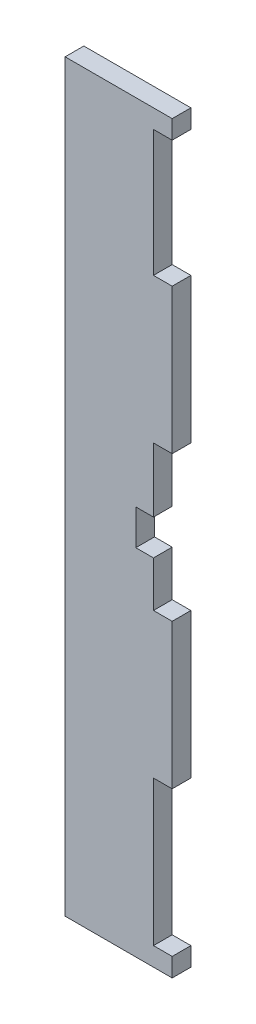
ISO-10303-21;
HEADER;
FILE_DESCRIPTION(('STEP AP214'),'2;1');
FILE_NAME('part.step','',(''),(''),'','','');
FILE_SCHEMA(('AUTOMOTIVE_DESIGN { 1 0 10303 214 1 1 1 1 }'));
ENDSEC;
DATA;
#1=APPLICATION_CONTEXT('core data for automotive mechanical design processes');
#2=APPLICATION_PROTOCOL_DEFINITION('international standard','automotive_design',2000,#1);
#3=PRODUCT_CONTEXT('',#1,'mechanical');
#4=PRODUCT('Part','Part','',(#3));
#5=PRODUCT_RELATED_PRODUCT_CATEGORY('part','',(#4));
#6=PRODUCT_DEFINITION_FORMATION('','',#4);
#7=PRODUCT_DEFINITION_CONTEXT('part definition',#1,'design');
#8=PRODUCT_DEFINITION('design','',#6,#7);
#9=PRODUCT_DEFINITION_SHAPE('','',#8);
#10=(LENGTH_UNIT() NAMED_UNIT(*) SI_UNIT(.MILLI.,.METRE.));
#11=(NAMED_UNIT(*) PLANE_ANGLE_UNIT() SI_UNIT($,.RADIAN.));
#12=(NAMED_UNIT(*) SI_UNIT($,.STERADIAN.) SOLID_ANGLE_UNIT());
#13=UNCERTAINTY_MEASURE_WITH_UNIT(LENGTH_MEASURE(1.E-05),#10,'distance_accuracy_value','');
#14=(GEOMETRIC_REPRESENTATION_CONTEXT(3) GLOBAL_UNCERTAINTY_ASSIGNED_CONTEXT((#13)) GLOBAL_UNIT_ASSIGNED_CONTEXT((#10,
#11,#12)) REPRESENTATION_CONTEXT('',''));
#15=CARTESIAN_POINT('',(0.,0.,0.));
#16=DIRECTION('',(0.,0.,1.));
#17=DIRECTION('',(1.,0.,0.));
#18=AXIS2_PLACEMENT_3D('',#15,#16,#17);
#19=CARTESIAN_POINT('',(15.,55.62,3.175));
#20=DIRECTION('',(-1.,0.,0.));
#21=DIRECTION('',(0.,-1.,0.));
#22=AXIS2_PLACEMENT_3D('',#19,#20,#21);
#23=PLANE('',#22);
#24=DIRECTION('',(0.,1.,0.));
#25=VECTOR('',#24,1.);
#26=CARTESIAN_POINT('',(15.,55.62,0.));
#27=LINE('',#26,#25);
#28=CARTESIAN_POINT('',(15.,55.62,0.));
#29=VERTEX_POINT('',#28);
#30=CARTESIAN_POINT('',(14.9999999999999,63.35,0.));
#31=VERTEX_POINT('',#30);
#32=EDGE_CURVE('E209',#29,#31,#27,.T.);
#33=ORIENTED_EDGE('',*,*,#32,.T.);
#34=DIRECTION('',(0.,0.,-1.));
#35=VECTOR('',#34,1.);
#36=CARTESIAN_POINT('',(14.9999999999999,63.35,3.176));
#37=LINE('',#36,#35);
#38=CARTESIAN_POINT('',(14.9999999999999,63.35,3.175));
#39=VERTEX_POINT('',#38);
#40=EDGE_CURVE('E326',#39,#31,#37,.T.);
#41=ORIENTED_EDGE('',*,*,#40,.F.);
#42=DIRECTION('',(0.,1.,0.));
#43=VECTOR('',#42,1.);
#44=CARTESIAN_POINT('',(15.,55.62,3.175));
#45=LINE('',#44,#43);
#46=CARTESIAN_POINT('',(15.,55.62,3.175));
#47=VERTEX_POINT('',#46);
#48=EDGE_CURVE('E293',#47,#39,#45,.T.);
#49=ORIENTED_EDGE('',*,*,#48,.F.);
#50=DIRECTION('',(0.,0.,-1.));
#51=VECTOR('',#50,1.);
#52=CARTESIAN_POINT('',(15.,55.62,3.175));
#53=LINE('',#52,#51);
#54=EDGE_CURVE('E240',#47,#29,#53,.T.);
#55=ORIENTED_EDGE('',*,*,#54,.T.);
#56=EDGE_LOOP('',(#33,#41,#49,#55));
#57=FACE_BOUND('',#56,.T.);
#58=ADVANCED_FACE('F33',(#57),#23,.F.);
#59=CARTESIAN_POINT('',(0.,3.175,3.175));
#60=DIRECTION('',(1.,0.,0.));
#61=DIRECTION('',(0.,0.,-1.));
#62=AXIS2_PLACEMENT_3D('',#59,#60,#61);
#63=PLANE('',#62);
#64=DIRECTION('',(0.,-1.,0.));
#65=VECTOR('',#64,1.);
#66=CARTESIAN_POINT('',(0.,3.175,0.));
#67=LINE('',#66,#65);
#68=CARTESIAN_POINT('',(0.,129.525,0.));
#69=VERTEX_POINT('',#68);
#70=CARTESIAN_POINT('',(0.,3.175,0.));
#71=VERTEX_POINT('',#70);
#72=EDGE_CURVE('E190',#69,#71,#67,.T.);
#73=ORIENTED_EDGE('',*,*,#72,.T.);
#74=DIRECTION('',(0.,0.,-1.));
#75=VECTOR('',#74,1.);
#76=CARTESIAN_POINT('',(0.,3.175,3.175));
#77=LINE('',#76,#75);
#78=CARTESIAN_POINT('',(0.,3.175,3.175));
#79=VERTEX_POINT('',#78);
#80=EDGE_CURVE('E11',#79,#71,#77,.T.);
#81=ORIENTED_EDGE('',*,*,#80,.F.);
#82=DIRECTION('',(0.,-1.,0.));
#83=VECTOR('',#82,1.);
#84=CARTESIAN_POINT('',(0.,3.175,3.175));
#85=LINE('',#84,#83);
#86=CARTESIAN_POINT('',(0.,129.525,3.175));
#87=VERTEX_POINT('',#86);
#88=EDGE_CURVE('E224',#87,#79,#85,.T.);
#89=ORIENTED_EDGE('',*,*,#88,.F.);
#90=DIRECTION('',(0.,0.,-1.));
#91=VECTOR('',#90,1.);
#92=CARTESIAN_POINT('',(0.,129.525,3.175));
#93=LINE('',#92,#91);
#94=EDGE_CURVE('E186',#87,#69,#93,.T.);
#95=ORIENTED_EDGE('',*,*,#94,.T.);
#96=EDGE_LOOP('',(#73,#81,#89,#95));
#97=FACE_BOUND('',#96,.T.);
#98=ADVANCED_FACE('F35',(#97),#63,.F.);
#99=CARTESIAN_POINT('',(18.1749999999999,3.17500000000001,3.175));
#100=DIRECTION('',(0.,1.,0.));
#101=DIRECTION('',(-1.,0.,0.));
#102=AXIS2_PLACEMENT_3D('',#99,#100,#101);
#103=PLANE('',#102);
#104=DIRECTION('',(1.,0.,0.));
#105=VECTOR('',#104,1.);
#106=CARTESIAN_POINT('',(18.1749999999999,3.17500000000001,0.));
#107=LINE('',#106,#105);
#108=CARTESIAN_POINT('',(18.1749999999999,3.17500000000001,0.));
#109=VERTEX_POINT('',#108);
#110=EDGE_CURVE('E193',#71,#109,#107,.T.);
#111=ORIENTED_EDGE('',*,*,#110,.T.);
#112=DIRECTION('',(0.,0.,-1.));
#113=VECTOR('',#112,1.);
#114=CARTESIAN_POINT('',(18.1749999999999,3.17500000000001,3.175));
#115=LINE('',#114,#113);
#116=CARTESIAN_POINT('',(18.1749999999999,3.17500000000001,3.175));
#117=VERTEX_POINT('',#116);
#118=EDGE_CURVE('E41',#117,#109,#115,.T.);
#119=ORIENTED_EDGE('',*,*,#118,.F.);
#120=DIRECTION('',(1.,0.,0.));
#121=VECTOR('',#120,1.);
#122=CARTESIAN_POINT('',(0.,3.175,3.175));
#123=LINE('',#122,#121);
#124=EDGE_CURVE('E121',#79,#117,#123,.T.);
#125=ORIENTED_EDGE('',*,*,#124,.F.);
#126=ORIENTED_EDGE('',*,*,#80,.T.);
#127=EDGE_LOOP('',(#111,#119,#125,#126));
#128=FACE_BOUND('',#127,.T.);
#129=ADVANCED_FACE('F396',(#128),#103,.F.);
#130=CARTESIAN_POINT('',(18.1749999999999,6.35000000000001,3.175));
#131=DIRECTION('',(-1.,0.,0.));
#132=DIRECTION('',(0.,0.,1.));
#133=AXIS2_PLACEMENT_3D('',#130,#131,#132);
#134=PLANE('',#133);
#135=DIRECTION('',(0.,1.,0.));
#136=VECTOR('',#135,1.);
#137=CARTESIAN_POINT('',(18.1749999999999,6.35000000000001,0.));
#138=LINE('',#137,#136);
#139=CARTESIAN_POINT('',(18.1749999999999,6.35000000000001,0.));
#140=VERTEX_POINT('',#139);
#141=EDGE_CURVE('E196',#109,#140,#138,.T.);
#142=ORIENTED_EDGE('',*,*,#141,.T.);
#143=DIRECTION('',(0.,0.,-1.));
#144=VECTOR('',#143,1.);
#145=CARTESIAN_POINT('',(18.1749999999999,6.35000000000001,3.175));
#146=LINE('',#145,#144);
#147=CARTESIAN_POINT('',(18.1749999999999,6.35000000000001,3.175));
#148=VERTEX_POINT('',#147);
#149=EDGE_CURVE('E255',#148,#140,#146,.T.);
#150=ORIENTED_EDGE('',*,*,#149,.F.);
#151=DIRECTION('',(0.,1.,0.));
#152=VECTOR('',#151,1.);
#153=CARTESIAN_POINT('',(18.1749999999999,6.35000000000001,3.175));
#154=LINE('',#153,#152);
#155=EDGE_CURVE('E263',#117,#148,#154,.T.);
#156=ORIENTED_EDGE('',*,*,#155,.F.);
#157=ORIENTED_EDGE('',*,*,#118,.T.);
#158=EDGE_LOOP('',(#142,#150,#156,#157));
#159=FACE_BOUND('',#158,.T.);
#160=ADVANCED_FACE('F261',(#159),#134,.F.);
#161=CARTESIAN_POINT('',(18.1749999999999,6.35000000000001,3.175));
#162=DIRECTION('',(0.,-1.,0.));
#163=DIRECTION('',(1.,0.,0.));
#164=AXIS2_PLACEMENT_3D('',#161,#162,#163);
#165=PLANE('',#164);
#166=DIRECTION('',(-1.,0.,0.));
#167=VECTOR('',#166,1.);
#168=CARTESIAN_POINT('',(18.1749999999999,6.35000000000001,0.));
#169=LINE('',#168,#167);
#170=CARTESIAN_POINT('',(14.9999999999999,6.35000000000001,0.));
#171=VERTEX_POINT('',#170);
#172=EDGE_CURVE('E198',#140,#171,#169,.T.);
#173=ORIENTED_EDGE('',*,*,#172,.T.);
#174=DIRECTION('',(0.,0.,-1.));
#175=VECTOR('',#174,1.);
#176=CARTESIAN_POINT('',(14.9999999999999,6.35000000000001,3.175));
#177=LINE('',#176,#175);
#178=CARTESIAN_POINT('',(14.9999999999999,6.35000000000001,3.175));
#179=VERTEX_POINT('',#178);
#180=EDGE_CURVE('E252',#179,#171,#177,.T.);
#181=ORIENTED_EDGE('',*,*,#180,.F.);
#182=DIRECTION('',(-1.,0.,0.));
#183=VECTOR('',#182,1.);
#184=CARTESIAN_POINT('',(18.1749999999999,6.35000000000001,3.175));
#185=LINE('',#184,#183);
#186=EDGE_CURVE('E282',#148,#179,#185,.T.);
#187=ORIENTED_EDGE('',*,*,#186,.F.);
#188=ORIENTED_EDGE('',*,*,#149,.T.);
#189=EDGE_LOOP('',(#173,#181,#187,#188));
#190=FACE_BOUND('',#189,.T.);
#191=ADVANCED_FACE('F273',(#190),#165,.F.);
#192=CARTESIAN_POINT('',(14.9999999999999,6.35000000000001,3.175));
#193=DIRECTION('',(-1.,0.,0.));
#194=DIRECTION('',(0.,-1.,0.));
#195=AXIS2_PLACEMENT_3D('',#192,#193,#194);
#196=PLANE('',#195);
#197=DIRECTION('',(0.,1.,0.));
#198=VECTOR('',#197,1.);
#199=CARTESIAN_POINT('',(14.9999999999999,6.35000000000001,0.));
#200=LINE('',#199,#198);
#201=CARTESIAN_POINT('',(15.,30.985,0.));
#202=VERTEX_POINT('',#201);
#203=EDGE_CURVE('E200',#171,#202,#200,.T.);
#204=ORIENTED_EDGE('',*,*,#203,.T.);
#205=DIRECTION('',(0.,0.,-1.));
#206=VECTOR('',#205,1.);
#207=CARTESIAN_POINT('',(15.,30.985,3.175));
#208=LINE('',#207,#206);
#209=CARTESIAN_POINT('',(15.,30.985,3.175));
#210=VERTEX_POINT('',#209);
#211=EDGE_CURVE('E249',#210,#202,#208,.T.);
#212=ORIENTED_EDGE('',*,*,#211,.F.);
#213=DIRECTION('',(0.,1.,0.));
#214=VECTOR('',#213,1.);
#215=CARTESIAN_POINT('',(14.9999999999999,6.35000000000001,3.175));
#216=LINE('',#215,#214);
#217=EDGE_CURVE('E279',#179,#210,#216,.T.);
#218=ORIENTED_EDGE('',*,*,#217,.F.);
#219=ORIENTED_EDGE('',*,*,#180,.T.);
#220=EDGE_LOOP('',(#204,#212,#218,#219));
#221=FACE_BOUND('',#220,.T.);
#222=ADVANCED_FACE('F277',(#221),#196,.F.);
#223=CARTESIAN_POINT('',(18.175,30.985,3.175));
#224=DIRECTION('',(0.,1.,0.));
#225=DIRECTION('',(-1.,0.,0.));
#226=AXIS2_PLACEMENT_3D('',#223,#224,#225);
#227=PLANE('',#226);
#228=DIRECTION('',(1.,0.,0.));
#229=VECTOR('',#228,1.);
#230=CARTESIAN_POINT('',(18.175,30.985,0.));
#231=LINE('',#230,#229);
#232=CARTESIAN_POINT('',(18.175,30.985,0.));
#233=VERTEX_POINT('',#232);
#234=EDGE_CURVE('E202',#202,#233,#231,.T.);
#235=ORIENTED_EDGE('',*,*,#234,.T.);
#236=DIRECTION('',(0.,0.,-1.));
#237=VECTOR('',#236,1.);
#238=CARTESIAN_POINT('',(18.175,30.985,3.175));
#239=LINE('',#238,#237);
#240=CARTESIAN_POINT('',(18.175,30.985,3.175));
#241=VERTEX_POINT('',#240);
#242=EDGE_CURVE('E246',#241,#233,#239,.T.);
#243=ORIENTED_EDGE('',*,*,#242,.F.);
#244=DIRECTION('',(1.,0.,0.));
#245=VECTOR('',#244,1.);
#246=CARTESIAN_POINT('',(18.175,30.985,3.175));
#247=LINE('',#246,#245);
#248=EDGE_CURVE('E281',#210,#241,#247,.T.);
#249=ORIENTED_EDGE('',*,*,#248,.F.);
#250=ORIENTED_EDGE('',*,*,#211,.T.);
#251=EDGE_LOOP('',(#235,#243,#249,#250));
#252=FACE_BOUND('',#251,.T.);
#253=ADVANCED_FACE('F408',(#252),#227,.F.);
#254=CARTESIAN_POINT('',(18.175,30.985,3.175));
#255=DIRECTION('',(-1.,0.,0.));
#256=DIRECTION('',(0.,-1.,0.));
#257=AXIS2_PLACEMENT_3D('',#254,#255,#256);
#258=PLANE('',#257);
#259=DIRECTION('',(0.,1.,0.));
#260=VECTOR('',#259,1.);
#261=CARTESIAN_POINT('',(18.175,30.985,0.));
#262=LINE('',#261,#260);
#263=CARTESIAN_POINT('',(18.175,55.62,0.));
#264=VERTEX_POINT('',#263);
#265=EDGE_CURVE('E204',#233,#264,#262,.T.);
#266=ORIENTED_EDGE('',*,*,#265,.T.);
#267=DIRECTION('',(0.,0.,-1.));
#268=VECTOR('',#267,1.);
#269=CARTESIAN_POINT('',(18.175,55.62,3.175));
#270=LINE('',#269,#268);
#271=CARTESIAN_POINT('',(18.175,55.62,3.175));
#272=VERTEX_POINT('',#271);
#273=EDGE_CURVE('E243',#272,#264,#270,.T.);
#274=ORIENTED_EDGE('',*,*,#273,.F.);
#275=DIRECTION('',(0.,1.,0.));
#276=VECTOR('',#275,1.);
#277=CARTESIAN_POINT('',(18.175,30.985,3.175));
#278=LINE('',#277,#276);
#279=EDGE_CURVE('E284',#241,#272,#278,.T.);
#280=ORIENTED_EDGE('',*,*,#279,.F.);
#281=ORIENTED_EDGE('',*,*,#242,.T.);
#282=EDGE_LOOP('',(#266,#274,#280,#281));
#283=FACE_BOUND('',#282,.T.);
#284=ADVANCED_FACE('F403',(#283),#258,.F.);
#285=CARTESIAN_POINT('',(18.175,55.62,3.175));
#286=DIRECTION('',(0.,-1.,0.));
#287=DIRECTION('',(0.,0.,-1.));
#288=AXIS2_PLACEMENT_3D('',#285,#286,#287);
#289=PLANE('',#288);
#290=DIRECTION('',(-1.,0.,0.));
#291=VECTOR('',#290,1.);
#292=CARTESIAN_POINT('',(18.175,55.62,0.));
#293=LINE('',#292,#291);
#294=EDGE_CURVE('E206',#264,#29,#293,.T.);
#295=ORIENTED_EDGE('',*,*,#294,.T.);
#296=ORIENTED_EDGE('',*,*,#54,.F.);
#297=DIRECTION('',(-1.,0.,0.));
#298=VECTOR('',#297,1.);
#299=CARTESIAN_POINT('',(18.175,55.62,3.175));
#300=LINE('',#299,#298);
#301=EDGE_CURVE('E290',#272,#47,#300,.T.);
#302=ORIENTED_EDGE('',*,*,#301,.F.);
#303=ORIENTED_EDGE('',*,*,#273,.T.);
#304=EDGE_LOOP('',(#295,#296,#302,#303));
#305=FACE_BOUND('',#304,.T.);
#306=ADVANCED_FACE('F399',(#305),#289,.F.);
#307=CARTESIAN_POINT('',(14.9999999999999,69.35,3.175));
#308=VERTEX_POINT('',#307);
#309=CARTESIAN_POINT('',(15.,80.255,3.175));
#310=VERTEX_POINT('',#309);
#311=EDGE_CURVE('E292',#308,#310,#45,.T.);
#312=ORIENTED_EDGE('',*,*,#311,.F.);
#313=DIRECTION('',(0.,0.,-1.));
#314=VECTOR('',#313,1.);
#315=CARTESIAN_POINT('',(14.9999999999999,69.35,3.176));
#316=LINE('',#315,#314);
#317=CARTESIAN_POINT('',(14.9999999999999,69.35,0.));
#318=VERTEX_POINT('',#317);
#319=EDGE_CURVE('E322',#308,#318,#316,.T.);
#320=ORIENTED_EDGE('',*,*,#319,.T.);
#321=CARTESIAN_POINT('',(15.,80.255,0.));
#322=VERTEX_POINT('',#321);
#323=EDGE_CURVE('E208',#318,#322,#27,.T.);
#324=ORIENTED_EDGE('',*,*,#323,.T.);
#325=DIRECTION('',(0.,0.,-1.));
#326=VECTOR('',#325,1.);
#327=CARTESIAN_POINT('',(15.,80.255,3.175));
#328=LINE('',#327,#326);
#329=EDGE_CURVE('E237',#310,#322,#328,.T.);
#330=ORIENTED_EDGE('',*,*,#329,.F.);
#331=EDGE_LOOP('',(#312,#320,#324,#330));
#332=FACE_BOUND('',#331,.T.);
#333=ADVANCED_FACE('F373',(#332),#23,.F.);
#334=CARTESIAN_POINT('',(18.175,80.255,3.175));
#335=DIRECTION('',(0.,1.,0.));
#336=DIRECTION('',(0.,0.,1.));
#337=AXIS2_PLACEMENT_3D('',#334,#335,#336);
#338=PLANE('',#337);
#339=DIRECTION('',(1.,0.,0.));
#340=VECTOR('',#339,1.);
#341=CARTESIAN_POINT('',(18.175,80.255,0.));
#342=LINE('',#341,#340);
#343=CARTESIAN_POINT('',(18.175,80.255,0.));
#344=VERTEX_POINT('',#343);
#345=EDGE_CURVE('E212',#322,#344,#342,.T.);
#346=ORIENTED_EDGE('',*,*,#345,.T.);
#347=DIRECTION('',(0.,0.,-1.));
#348=VECTOR('',#347,1.);
#349=CARTESIAN_POINT('',(18.175,80.255,3.175));
#350=LINE('',#349,#348);
#351=CARTESIAN_POINT('',(18.175,80.255,3.175));
#352=VERTEX_POINT('',#351);
#353=EDGE_CURVE('E234',#352,#344,#350,.T.);
#354=ORIENTED_EDGE('',*,*,#353,.F.);
#355=DIRECTION('',(1.,0.,0.));
#356=VECTOR('',#355,1.);
#357=CARTESIAN_POINT('',(18.175,80.255,3.175));
#358=LINE('',#357,#356);
#359=EDGE_CURVE('E295',#310,#352,#358,.T.);
#360=ORIENTED_EDGE('',*,*,#359,.F.);
#361=ORIENTED_EDGE('',*,*,#329,.T.);
#362=EDGE_LOOP('',(#346,#354,#360,#361));
#363=FACE_BOUND('',#362,.T.);
#364=ADVANCED_FACE('F379',(#363),#338,.F.);
#365=CARTESIAN_POINT('',(18.175,80.255,3.175));
#366=DIRECTION('',(-1.,0.,0.));
#367=DIRECTION('',(0.,-1.,0.));
#368=AXIS2_PLACEMENT_3D('',#365,#366,#367);
#369=PLANE('',#368);
#370=DIRECTION('',(0.,1.,0.));
#371=VECTOR('',#370,1.);
#372=CARTESIAN_POINT('',(18.175,80.255,0.));
#373=LINE('',#372,#371);
#374=CARTESIAN_POINT('',(18.175,104.89,0.));
#375=VERTEX_POINT('',#374);
#376=EDGE_CURVE('E214',#344,#375,#373,.T.);
#377=ORIENTED_EDGE('',*,*,#376,.T.);
#378=DIRECTION('',(0.,0.,-1.));
#379=VECTOR('',#378,1.);
#380=CARTESIAN_POINT('',(18.175,104.89,3.175));
#381=LINE('',#380,#379);
#382=CARTESIAN_POINT('',(18.175,104.89,3.175));
#383=VERTEX_POINT('',#382);
#384=EDGE_CURVE('E231',#383,#375,#381,.T.);
#385=ORIENTED_EDGE('',*,*,#384,.F.);
#386=DIRECTION('',(0.,1.,0.));
#387=VECTOR('',#386,1.);
#388=CARTESIAN_POINT('',(18.175,80.255,3.175));
#389=LINE('',#388,#387);
#390=EDGE_CURVE('E297',#352,#383,#389,.T.);
#391=ORIENTED_EDGE('',*,*,#390,.F.);
#392=ORIENTED_EDGE('',*,*,#353,.T.);
#393=EDGE_LOOP('',(#377,#385,#391,#392));
#394=FACE_BOUND('',#393,.T.);
#395=ADVANCED_FACE('F382',(#394),#369,.F.);
#396=CARTESIAN_POINT('',(18.175,104.89,3.175));
#397=DIRECTION('',(0.,-1.,0.));
#398=DIRECTION('',(0.,0.,-1.));
#399=AXIS2_PLACEMENT_3D('',#396,#397,#398);
#400=PLANE('',#399);
#401=DIRECTION('',(-1.,0.,0.));
#402=VECTOR('',#401,1.);
#403=CARTESIAN_POINT('',(18.175,104.89,0.));
#404=LINE('',#403,#402);
#405=CARTESIAN_POINT('',(15.,104.89,0.));
#406=VERTEX_POINT('',#405);
#407=EDGE_CURVE('E216',#375,#406,#404,.T.);
#408=ORIENTED_EDGE('',*,*,#407,.T.);
#409=DIRECTION('',(0.,0.,-1.));
#410=VECTOR('',#409,1.);
#411=CARTESIAN_POINT('',(15.,104.89,3.175));
#412=LINE('',#411,#410);
#413=CARTESIAN_POINT('',(15.,104.89,3.175));
#414=VERTEX_POINT('',#413);
#415=EDGE_CURVE('E228',#414,#406,#412,.T.);
#416=ORIENTED_EDGE('',*,*,#415,.F.);
#417=DIRECTION('',(-1.,0.,0.));
#418=VECTOR('',#417,1.);
#419=CARTESIAN_POINT('',(18.175,104.89,3.175));
#420=LINE('',#419,#418);
#421=EDGE_CURVE('E299',#383,#414,#420,.T.);
#422=ORIENTED_EDGE('',*,*,#421,.F.);
#423=ORIENTED_EDGE('',*,*,#384,.T.);
#424=EDGE_LOOP('',(#408,#416,#422,#423));
#425=FACE_BOUND('',#424,.T.);
#426=ADVANCED_FACE('F305',(#425),#400,.F.);
#427=CARTESIAN_POINT('',(15.,104.89,3.175));
#428=DIRECTION('',(-1.,0.,0.));
#429=DIRECTION('',(0.,-1.,0.));
#430=AXIS2_PLACEMENT_3D('',#427,#428,#429);
#431=PLANE('',#430);
#432=DIRECTION('',(0.,1.,0.));
#433=VECTOR('',#432,1.);
#434=CARTESIAN_POINT('',(15.,104.89,0.));
#435=LINE('',#434,#433);
#436=CARTESIAN_POINT('',(15.,126.35,0.));
#437=VERTEX_POINT('',#436);
#438=EDGE_CURVE('E218',#406,#437,#435,.T.);
#439=ORIENTED_EDGE('',*,*,#438,.T.);
#440=DIRECTION('',(0.,0.,-1.));
#441=VECTOR('',#440,1.);
#442=CARTESIAN_POINT('',(15.,126.35,3.175));
#443=LINE('',#442,#441);
#444=CARTESIAN_POINT('',(15.,126.35,3.175));
#445=VERTEX_POINT('',#444);
#446=EDGE_CURVE('E181',#445,#437,#443,.T.);
#447=ORIENTED_EDGE('',*,*,#446,.F.);
#448=DIRECTION('',(0.,1.,0.));
#449=VECTOR('',#448,1.);
#450=CARTESIAN_POINT('',(15.,104.89,3.175));
#451=LINE('',#450,#449);
#452=EDGE_CURVE('E168',#414,#445,#451,.T.);
#453=ORIENTED_EDGE('',*,*,#452,.F.);
#454=ORIENTED_EDGE('',*,*,#415,.T.);
#455=EDGE_LOOP('',(#439,#447,#453,#454));
#456=FACE_BOUND('',#455,.T.);
#457=ADVANCED_FACE('F309',(#456),#431,.F.);
#458=CARTESIAN_POINT('',(18.1749999999999,126.35,3.175));
#459=DIRECTION('',(0.,1.,0.));
#460=DIRECTION('',(-1.,0.,0.));
#461=AXIS2_PLACEMENT_3D('',#458,#459,#460);
#462=PLANE('',#461);
#463=DIRECTION('',(1.,0.,0.));
#464=VECTOR('',#463,1.);
#465=CARTESIAN_POINT('',(18.1749999999999,126.35,0.));
#466=LINE('',#465,#464);
#467=CARTESIAN_POINT('',(18.1749999999999,126.35,0.));
#468=VERTEX_POINT('',#467);
#469=EDGE_CURVE('E177',#437,#468,#466,.T.);
#470=ORIENTED_EDGE('',*,*,#469,.T.);
#471=DIRECTION('',(0.,0.,-1.));
#472=VECTOR('',#471,1.);
#473=CARTESIAN_POINT('',(18.1749999999999,126.35,3.175));
#474=LINE('',#473,#472);
#475=CARTESIAN_POINT('',(18.1749999999999,126.35,3.175));
#476=VERTEX_POINT('',#475);
#477=EDGE_CURVE('E174',#476,#468,#474,.T.);
#478=ORIENTED_EDGE('',*,*,#477,.F.);
#479=DIRECTION('',(1.,0.,0.));
#480=VECTOR('',#479,1.);
#481=CARTESIAN_POINT('',(18.1749999999999,126.35,3.175));
#482=LINE('',#481,#480);
#483=EDGE_CURVE('E160',#445,#476,#482,.T.);
#484=ORIENTED_EDGE('',*,*,#483,.F.);
#485=ORIENTED_EDGE('',*,*,#446,.T.);
#486=EDGE_LOOP('',(#470,#478,#484,#485));
#487=FACE_BOUND('',#486,.T.);
#488=ADVANCED_FACE('F175',(#487),#462,.F.);
#489=CARTESIAN_POINT('',(18.1749999999999,129.525,3.175));
#490=DIRECTION('',(-1.,0.,0.));
#491=DIRECTION('',(0.,0.,1.));
#492=AXIS2_PLACEMENT_3D('',#489,#490,#491);
#493=PLANE('',#492);
#494=DIRECTION('',(0.,1.,0.));
#495=VECTOR('',#494,1.);
#496=CARTESIAN_POINT('',(18.1749999999999,129.525,0.));
#497=LINE('',#496,#495);
#498=CARTESIAN_POINT('',(18.1749999999999,129.525,0.));
#499=VERTEX_POINT('',#498);
#500=EDGE_CURVE('E221',#468,#499,#497,.T.);
#501=ORIENTED_EDGE('',*,*,#500,.T.);
#502=DIRECTION('',(0.,0.,-1.));
#503=VECTOR('',#502,1.);
#504=CARTESIAN_POINT('',(18.1749999999999,129.525,3.175));
#505=LINE('',#504,#503);
#506=CARTESIAN_POINT('',(18.1749999999999,129.525,3.175));
#507=VERTEX_POINT('',#506);
#508=EDGE_CURVE('E182',#507,#499,#505,.T.);
#509=ORIENTED_EDGE('',*,*,#508,.F.);
#510=DIRECTION('',(0.,1.,0.));
#511=VECTOR('',#510,1.);
#512=CARTESIAN_POINT('',(18.1749999999999,129.525,3.175));
#513=LINE('',#512,#511);
#514=EDGE_CURVE('E165',#476,#507,#513,.T.);
#515=ORIENTED_EDGE('',*,*,#514,.F.);
#516=ORIENTED_EDGE('',*,*,#477,.T.);
#517=EDGE_LOOP('',(#501,#509,#515,#516));
#518=FACE_BOUND('',#517,.T.);
#519=ADVANCED_FACE('F184',(#518),#493,.F.);
#520=CARTESIAN_POINT('',(0.,129.525,3.175));
#521=DIRECTION('',(0.,-1.,0.));
#522=DIRECTION('',(0.,0.,-1.));
#523=AXIS2_PLACEMENT_3D('',#520,#521,#522);
#524=PLANE('',#523);
#525=DIRECTION('',(-1.,0.,0.));
#526=VECTOR('',#525,1.);
#527=CARTESIAN_POINT('',(0.,129.525,0.));
#528=LINE('',#527,#526);
#529=EDGE_CURVE('E113',#499,#69,#528,.T.);
#530=ORIENTED_EDGE('',*,*,#529,.T.);
#531=ORIENTED_EDGE('',*,*,#94,.F.);
#532=DIRECTION('',(-1.,0.,0.));
#533=VECTOR('',#532,1.);
#534=CARTESIAN_POINT('',(18.1749999999999,129.525,3.175));
#535=LINE('',#534,#533);
#536=EDGE_CURVE('E57',#507,#87,#535,.T.);
#537=ORIENTED_EDGE('',*,*,#536,.F.);
#538=ORIENTED_EDGE('',*,*,#508,.T.);
#539=EDGE_LOOP('',(#530,#531,#537,#538));
#540=FACE_BOUND('',#539,.T.);
#541=ADVANCED_FACE('F310',(#540),#524,.F.);
#542=CARTESIAN_POINT('',(0.,0.,3.175));
#543=DIRECTION('',(0.,0.,-1.));
#544=DIRECTION('',(-1.,0.,0.));
#545=AXIS2_PLACEMENT_3D('',#542,#543,#544);
#546=PLANE('',#545);
#547=ORIENTED_EDGE('',*,*,#48,.T.);
#548=DIRECTION('',(1.,0.,0.));
#549=VECTOR('',#548,1.);
#550=CARTESIAN_POINT('',(11.9999999999999,63.35,3.175));
#551=LINE('',#550,#549);
#552=CARTESIAN_POINT('',(11.9999999999999,63.35,3.175));
#553=VERTEX_POINT('',#552);
#554=EDGE_CURVE('E336',#553,#39,#551,.T.);
#555=ORIENTED_EDGE('',*,*,#554,.F.);
#556=DIRECTION('',(0.,-1.,0.));
#557=VECTOR('',#556,1.);
#558=CARTESIAN_POINT('',(11.9999999999999,69.35,3.175));
#559=LINE('',#558,#557);
#560=CARTESIAN_POINT('',(11.9999999999999,69.35,3.175));
#561=VERTEX_POINT('',#560);
#562=EDGE_CURVE('E339',#561,#553,#559,.T.);
#563=ORIENTED_EDGE('',*,*,#562,.F.);
#564=DIRECTION('',(-1.,0.,0.));
#565=VECTOR('',#564,1.);
#566=CARTESIAN_POINT('',(11.9999999999999,69.35,3.175));
#567=LINE('',#566,#565);
#568=EDGE_CURVE('E194',#308,#561,#567,.T.);
#569=ORIENTED_EDGE('',*,*,#568,.F.);
#570=ORIENTED_EDGE('',*,*,#311,.T.);
#571=ORIENTED_EDGE('',*,*,#359,.T.);
#572=ORIENTED_EDGE('',*,*,#390,.T.);
#573=ORIENTED_EDGE('',*,*,#421,.T.);
#574=ORIENTED_EDGE('',*,*,#452,.T.);
#575=ORIENTED_EDGE('',*,*,#483,.T.);
#576=ORIENTED_EDGE('',*,*,#514,.T.);
#577=ORIENTED_EDGE('',*,*,#536,.T.);
#578=ORIENTED_EDGE('',*,*,#88,.T.);
#579=ORIENTED_EDGE('',*,*,#124,.T.);
#580=ORIENTED_EDGE('',*,*,#155,.T.);
#581=ORIENTED_EDGE('',*,*,#186,.T.);
#582=ORIENTED_EDGE('',*,*,#217,.T.);
#583=ORIENTED_EDGE('',*,*,#248,.T.);
#584=ORIENTED_EDGE('',*,*,#279,.T.);
#585=ORIENTED_EDGE('',*,*,#301,.T.);
#586=EDGE_LOOP('',(#547,#555,#563,#569,#570,#571,#572,#573,#574,#575,#576,#577,#578,#579,#580,
#581,#582,#583,#584,#585));
#587=FACE_BOUND('',#586,.T.);
#588=ADVANCED_FACE('F163',(#587),#546,.F.);
#589=CARTESIAN_POINT('',(0.,0.,0.));
#590=DIRECTION('',(0.,0.,-1.));
#591=DIRECTION('',(-1.,0.,0.));
#592=AXIS2_PLACEMENT_3D('',#589,#590,#591);
#593=PLANE('',#592);
#594=DIRECTION('',(-1.,0.,0.));
#595=VECTOR('',#594,1.);
#596=CARTESIAN_POINT('',(11.9999999999999,63.35,0.));
#597=LINE('',#596,#595);
#598=CARTESIAN_POINT('',(11.9999999999999,63.35,0.));
#599=VERTEX_POINT('',#598);
#600=EDGE_CURVE('E323',#31,#599,#597,.T.);
#601=ORIENTED_EDGE('',*,*,#600,.F.);
#602=ORIENTED_EDGE('',*,*,#32,.F.);
#603=ORIENTED_EDGE('',*,*,#294,.F.);
#604=ORIENTED_EDGE('',*,*,#265,.F.);
#605=ORIENTED_EDGE('',*,*,#234,.F.);
#606=ORIENTED_EDGE('',*,*,#203,.F.);
#607=ORIENTED_EDGE('',*,*,#172,.F.);
#608=ORIENTED_EDGE('',*,*,#141,.F.);
#609=ORIENTED_EDGE('',*,*,#110,.F.);
#610=ORIENTED_EDGE('',*,*,#72,.F.);
#611=ORIENTED_EDGE('',*,*,#529,.F.);
#612=ORIENTED_EDGE('',*,*,#500,.F.);
#613=ORIENTED_EDGE('',*,*,#469,.F.);
#614=ORIENTED_EDGE('',*,*,#438,.F.);
#615=ORIENTED_EDGE('',*,*,#407,.F.);
#616=ORIENTED_EDGE('',*,*,#376,.F.);
#617=ORIENTED_EDGE('',*,*,#345,.F.);
#618=ORIENTED_EDGE('',*,*,#323,.F.);
#619=DIRECTION('',(1.,0.,0.));
#620=VECTOR('',#619,1.);
#621=CARTESIAN_POINT('',(11.9999999999999,69.35,0.));
#622=LINE('',#621,#620);
#623=CARTESIAN_POINT('',(11.9999999999999,69.35,0.));
#624=VERTEX_POINT('',#623);
#625=EDGE_CURVE('E332',#624,#318,#622,.T.);
#626=ORIENTED_EDGE('',*,*,#625,.F.);
#627=DIRECTION('',(0.,1.,0.));
#628=VECTOR('',#627,1.);
#629=CARTESIAN_POINT('',(11.9999999999999,69.35,0.));
#630=LINE('',#629,#628);
#631=EDGE_CURVE('E48',#599,#624,#630,.T.);
#632=ORIENTED_EDGE('',*,*,#631,.F.);
#633=EDGE_LOOP('',(#601,#602,#603,#604,#605,#606,#607,#608,#609,#610,#611,#612,#613,#614,#615,
#616,#617,#618,#626,#632));
#634=FACE_BOUND('',#633,.T.);
#635=ADVANCED_FACE('F267',(#634),#593,.T.);
#636=CARTESIAN_POINT('',(11.9999999999999,69.35,3.176));
#637=DIRECTION('',(-1.,0.,0.));
#638=DIRECTION('',(0.,-1.,0.));
#639=AXIS2_PLACEMENT_3D('',#636,#637,#638);
#640=PLANE('',#639);
#641=ORIENTED_EDGE('',*,*,#562,.T.);
#642=DIRECTION('',(0.,0.,-1.));
#643=VECTOR('',#642,1.);
#644=CARTESIAN_POINT('',(11.9999999999999,63.35,3.176));
#645=LINE('',#644,#643);
#646=EDGE_CURVE('E319',#553,#599,#645,.T.);
#647=ORIENTED_EDGE('',*,*,#646,.T.);
#648=ORIENTED_EDGE('',*,*,#631,.T.);
#649=DIRECTION('',(0.,0.,-1.));
#650=VECTOR('',#649,1.);
#651=CARTESIAN_POINT('',(11.9999999999999,69.35,3.176));
#652=LINE('',#651,#650);
#653=EDGE_CURVE('E320',#561,#624,#652,.T.);
#654=ORIENTED_EDGE('',*,*,#653,.F.);
#655=EDGE_LOOP('',(#641,#647,#648,#654));
#656=FACE_BOUND('',#655,.T.);
#657=ADVANCED_FACE('F343',(#656),#640,.F.);
#658=CARTESIAN_POINT('',(11.9999999999999,63.35,3.176));
#659=DIRECTION('',(0.,-1.,0.));
#660=DIRECTION('',(0.,0.,-1.));
#661=AXIS2_PLACEMENT_3D('',#658,#659,#660);
#662=PLANE('',#661);
#663=ORIENTED_EDGE('',*,*,#554,.T.);
#664=ORIENTED_EDGE('',*,*,#40,.T.);
#665=ORIENTED_EDGE('',*,*,#600,.T.);
#666=ORIENTED_EDGE('',*,*,#646,.F.);
#667=EDGE_LOOP('',(#663,#664,#665,#666));
#668=FACE_BOUND('',#667,.T.);
#669=ADVANCED_FACE('F352',(#668),#662,.F.);
#670=CARTESIAN_POINT('',(11.9999999999999,69.35,3.176));
#671=DIRECTION('',(0.,1.,0.));
#672=DIRECTION('',(0.,0.,1.));
#673=AXIS2_PLACEMENT_3D('',#670,#671,#672);
#674=PLANE('',#673);
#675=ORIENTED_EDGE('',*,*,#568,.T.);
#676=ORIENTED_EDGE('',*,*,#653,.T.);
#677=ORIENTED_EDGE('',*,*,#625,.T.);
#678=ORIENTED_EDGE('',*,*,#319,.F.);
#679=EDGE_LOOP('',(#675,#676,#677,#678));
#680=FACE_BOUND('',#679,.T.);
#681=ADVANCED_FACE('F369',(#680),#674,.F.);
#682=CLOSED_SHELL('',(#58,#98,#129,#160,#191,#222,#253,#284,#306,#333,#364,#395,#426,#457,#488,
#519,#541,#588,#635,#657,#669,#681));
#683=MANIFOLD_SOLID_BREP('B2',#682);
#684=ADVANCED_BREP_SHAPE_REPRESENTATION('',(#18,#683),#14);
#685=SHAPE_DEFINITION_REPRESENTATION(#9,#684);
ENDSEC;
END-ISO-10303-21;
